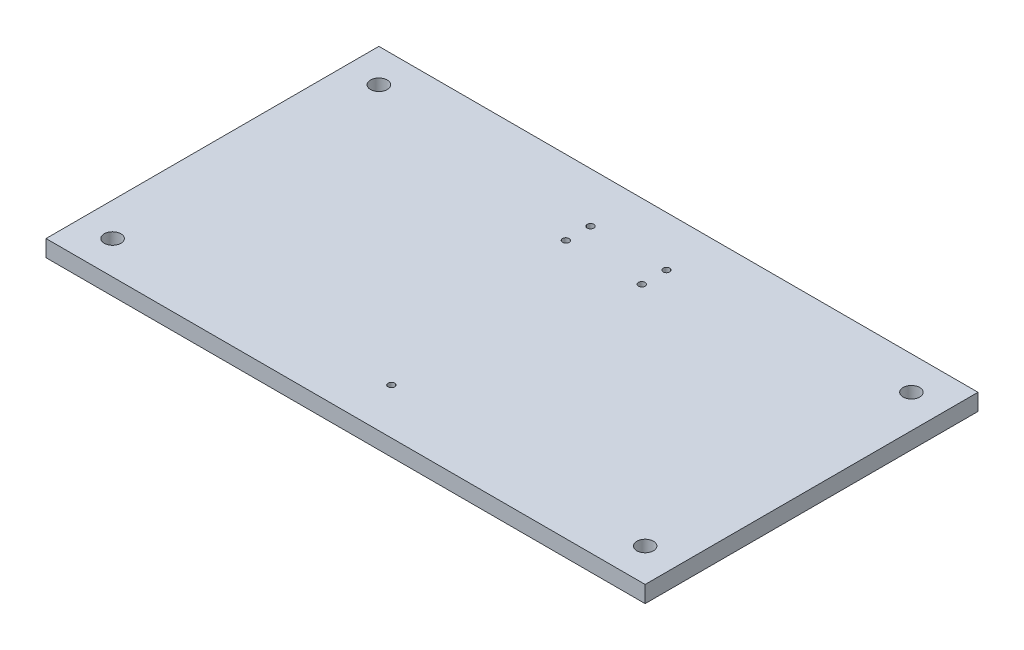
ISO-10303-21;
HEADER;
FILE_DESCRIPTION(('STEP AP214'),'2;1');
FILE_NAME('part.step','',(''),(''),'','','');
FILE_SCHEMA(('AUTOMOTIVE_DESIGN { 1 0 10303 214 1 1 1 1 }'));
ENDSEC;
DATA;
#1=APPLICATION_CONTEXT('core data for automotive mechanical design processes');
#2=APPLICATION_PROTOCOL_DEFINITION('international standard','automotive_design',2000,#1);
#3=PRODUCT_CONTEXT('',#1,'mechanical');
#4=PRODUCT('Part','Part','',(#3));
#5=PRODUCT_RELATED_PRODUCT_CATEGORY('part','',(#4));
#6=PRODUCT_DEFINITION_FORMATION('','',#4);
#7=PRODUCT_DEFINITION_CONTEXT('part definition',#1,'design');
#8=PRODUCT_DEFINITION('design','',#6,#7);
#9=PRODUCT_DEFINITION_SHAPE('','',#8);
#10=(LENGTH_UNIT() NAMED_UNIT(*) SI_UNIT(.MILLI.,.METRE.));
#11=(NAMED_UNIT(*) PLANE_ANGLE_UNIT() SI_UNIT($,.RADIAN.));
#12=(NAMED_UNIT(*) SI_UNIT($,.STERADIAN.) SOLID_ANGLE_UNIT());
#13=UNCERTAINTY_MEASURE_WITH_UNIT(LENGTH_MEASURE(1.E-05),#10,'distance_accuracy_value','');
#14=(GEOMETRIC_REPRESENTATION_CONTEXT(3) GLOBAL_UNCERTAINTY_ASSIGNED_CONTEXT((#13)) GLOBAL_UNIT_ASSIGNED_CONTEXT((#10,
#11,#12)) REPRESENTATION_CONTEXT('',''));
#15=CARTESIAN_POINT('',(0.,0.,0.));
#16=DIRECTION('',(0.,0.,1.));
#17=DIRECTION('',(1.,0.,0.));
#18=AXIS2_PLACEMENT_3D('',#15,#16,#17);
#19=CARTESIAN_POINT('',(0.,6.35,0.));
#20=DIRECTION('',(0.,-1.,0.));
#21=DIRECTION('',(0.,0.,-1.));
#22=AXIS2_PLACEMENT_3D('',#19,#20,#21);
#23=PLANE('',#22);
#24=DIRECTION('',(0.,0.,-1.));
#25=VECTOR('',#24,1.);
#26=CARTESIAN_POINT('',(190.5,6.35,69.85));
#27=LINE('',#26,#25);
#28=CARTESIAN_POINT('',(190.5,6.35,69.85));
#29=VERTEX_POINT('',#28);
#30=CARTESIAN_POINT('',(190.5,6.35,-57.15));
#31=VERTEX_POINT('',#30);
#32=EDGE_CURVE('E84',#29,#31,#27,.T.);
#33=ORIENTED_EDGE('',*,*,#32,.T.);
#34=DIRECTION('',(-1.,0.,0.));
#35=VECTOR('',#34,1.);
#36=CARTESIAN_POINT('',(-38.1,6.35,-57.15));
#37=LINE('',#36,#35);
#38=CARTESIAN_POINT('',(-38.1,6.35,-57.15));
#39=VERTEX_POINT('',#38);
#40=EDGE_CURVE('E79',#31,#39,#37,.T.);
#41=ORIENTED_EDGE('',*,*,#40,.T.);
#42=DIRECTION('',(0.,0.,1.));
#43=VECTOR('',#42,1.);
#44=CARTESIAN_POINT('',(-38.1,6.35,69.85));
#45=LINE('',#44,#43);
#46=CARTESIAN_POINT('',(-38.1,6.35,69.85));
#47=VERTEX_POINT('',#46);
#48=EDGE_CURVE('E82',#39,#47,#45,.T.);
#49=ORIENTED_EDGE('',*,*,#48,.T.);
#50=DIRECTION('',(1.,0.,0.));
#51=VECTOR('',#50,1.);
#52=CARTESIAN_POINT('',(-38.1,6.35,69.85));
#53=LINE('',#52,#51);
#54=EDGE_CURVE('E49',#47,#29,#53,.T.);
#55=ORIENTED_EDGE('',*,*,#54,.T.);
#56=EDGE_LOOP('',(#33,#41,#49,#55));
#57=FACE_BOUND('',#56,.T.);
#58=CARTESIAN_POINT('',(61.71311,6.35,-38.1));
#59=DIRECTION('',(0.,1.,0.));
#60=DIRECTION('',(0.,0.,1.));
#61=AXIS2_PLACEMENT_3D('',#58,#59,#60);
#62=CIRCLE('',#61,1.26999999999999);
#63=CARTESIAN_POINT('',(61.71311,6.35,-36.83));
#64=VERTEX_POINT('',#63);
#65=EDGE_CURVE('E99',#64,#64,#62,.T.);
#66=ORIENTED_EDGE('',*,*,#65,.F.);
#67=EDGE_LOOP('',(#66));
#68=FACE_BOUND('',#67,.T.);
#69=CARTESIAN_POINT('',(90.68689,6.35,-38.1));
#70=DIRECTION('',(0.,1.,0.));
#71=DIRECTION('',(0.,0.,1.));
#72=AXIS2_PLACEMENT_3D('',#69,#70,#71);
#73=CIRCLE('',#72,1.26999999999999);
#74=CARTESIAN_POINT('',(90.68689,6.35,-36.83));
#75=VERTEX_POINT('',#74);
#76=EDGE_CURVE('E114',#75,#75,#73,.T.);
#77=ORIENTED_EDGE('',*,*,#76,.F.);
#78=EDGE_LOOP('',(#77));
#79=FACE_BOUND('',#78,.T.);
#80=CARTESIAN_POINT('',(76.2,6.35,52.35956));
#81=DIRECTION('',(0.,1.,0.));
#82=DIRECTION('',(0.,0.,1.));
#83=AXIS2_PLACEMENT_3D('',#80,#81,#82);
#84=CIRCLE('',#83,1.27000000000001);
#85=CARTESIAN_POINT('',(76.2,6.35,53.62956));
#86=VERTEX_POINT('',#85);
#87=EDGE_CURVE('E120',#86,#86,#84,.T.);
#88=ORIENTED_EDGE('',*,*,#87,.F.);
#89=EDGE_LOOP('',(#88));
#90=FACE_BOUND('',#89,.T.);
#91=CARTESIAN_POINT('',(61.71311,6.35,-28.69946));
#92=DIRECTION('',(0.,1.,0.));
#93=DIRECTION('',(0.,0.,1.));
#94=AXIS2_PLACEMENT_3D('',#91,#92,#93);
#95=CIRCLE('',#94,1.26999999999999);
#96=CARTESIAN_POINT('',(61.71311,6.35,-27.42946));
#97=VERTEX_POINT('',#96);
#98=EDGE_CURVE('E126',#97,#97,#95,.T.);
#99=ORIENTED_EDGE('',*,*,#98,.F.);
#100=EDGE_LOOP('',(#99));
#101=FACE_BOUND('',#100,.T.);
#102=CARTESIAN_POINT('',(90.68689,6.35,-28.69946));
#103=DIRECTION('',(0.,1.,0.));
#104=DIRECTION('',(0.,0.,1.));
#105=AXIS2_PLACEMENT_3D('',#102,#103,#104);
#106=CIRCLE('',#105,1.26999999999999);
#107=CARTESIAN_POINT('',(90.68689,6.35,-27.42946));
#108=VERTEX_POINT('',#107);
#109=EDGE_CURVE('E132',#108,#108,#106,.T.);
#110=ORIENTED_EDGE('',*,*,#109,.F.);
#111=EDGE_LOOP('',(#110));
#112=FACE_BOUND('',#111,.T.);
#113=CARTESIAN_POINT('',(-25.4,6.35,-44.45));
#114=DIRECTION('',(0.,1.,0.));
#115=DIRECTION('',(0.,0.,1.));
#116=AXIS2_PLACEMENT_3D('',#113,#114,#115);
#117=CIRCLE('',#116,3.175);
#118=CARTESIAN_POINT('',(-25.4,6.35,-41.275));
#119=VERTEX_POINT('',#118);
#120=EDGE_CURVE('E138',#119,#119,#117,.T.);
#121=ORIENTED_EDGE('',*,*,#120,.F.);
#122=EDGE_LOOP('',(#121));
#123=FACE_BOUND('',#122,.T.);
#124=CARTESIAN_POINT('',(177.8,6.35,-44.45));
#125=DIRECTION('',(0.,1.,0.));
#126=DIRECTION('',(0.,0.,1.));
#127=AXIS2_PLACEMENT_3D('',#124,#125,#126);
#128=CIRCLE('',#127,3.175);
#129=CARTESIAN_POINT('',(177.8,6.35,-41.275));
#130=VERTEX_POINT('',#129);
#131=EDGE_CURVE('E144',#130,#130,#128,.T.);
#132=ORIENTED_EDGE('',*,*,#131,.F.);
#133=EDGE_LOOP('',(#132));
#134=FACE_BOUND('',#133,.T.);
#135=CARTESIAN_POINT('',(177.800000000001,6.35,57.15));
#136=DIRECTION('',(0.,1.,0.));
#137=DIRECTION('',(0.,0.,1.));
#138=AXIS2_PLACEMENT_3D('',#135,#136,#137);
#139=CIRCLE('',#138,3.175);
#140=CARTESIAN_POINT('',(177.800000000001,6.35,60.325));
#141=VERTEX_POINT('',#140);
#142=EDGE_CURVE('E150',#141,#141,#139,.T.);
#143=ORIENTED_EDGE('',*,*,#142,.F.);
#144=EDGE_LOOP('',(#143));
#145=FACE_BOUND('',#144,.T.);
#146=CARTESIAN_POINT('',(-25.3999999999989,6.35,57.15));
#147=DIRECTION('',(0.,1.,0.));
#148=DIRECTION('',(0.,0.,1.));
#149=AXIS2_PLACEMENT_3D('',#146,#147,#148);
#150=CIRCLE('',#149,3.175);
#151=CARTESIAN_POINT('',(-25.3999999999989,6.35,60.325));
#152=VERTEX_POINT('',#151);
#153=EDGE_CURVE('E156',#152,#152,#150,.T.);
#154=ORIENTED_EDGE('',*,*,#153,.F.);
#155=EDGE_LOOP('',(#154));
#156=FACE_BOUND('',#155,.T.);
#157=ADVANCED_FACE('F32',(#57,#68,#79,#90,#101,#112,#123,#134,#145,#156),#23,.F.);
#158=CARTESIAN_POINT('',(0.,0.,0.));
#159=DIRECTION('',(0.,-1.,0.));
#160=DIRECTION('',(0.,0.,-1.));
#161=AXIS2_PLACEMENT_3D('',#158,#159,#160);
#162=PLANE('',#161);
#163=CARTESIAN_POINT('',(177.800000000001,0.,57.15));
#164=DIRECTION('',(0.,1.,0.));
#165=DIRECTION('',(0.,0.,1.));
#166=AXIS2_PLACEMENT_3D('',#163,#164,#165);
#167=CIRCLE('',#166,3.175);
#168=CARTESIAN_POINT('',(177.800000000001,0.,60.325));
#169=VERTEX_POINT('',#168);
#170=EDGE_CURVE('E153',#169,#169,#167,.T.);
#171=ORIENTED_EDGE('',*,*,#170,.T.);
#172=EDGE_LOOP('',(#171));
#173=FACE_BOUND('',#172,.T.);
#174=CARTESIAN_POINT('',(-25.4,0.,-44.45));
#175=DIRECTION('',(0.,1.,0.));
#176=DIRECTION('',(0.,0.,1.));
#177=AXIS2_PLACEMENT_3D('',#174,#175,#176);
#178=CIRCLE('',#177,3.175);
#179=CARTESIAN_POINT('',(-25.4,0.,-41.275));
#180=VERTEX_POINT('',#179);
#181=EDGE_CURVE('E141',#180,#180,#178,.T.);
#182=ORIENTED_EDGE('',*,*,#181,.T.);
#183=EDGE_LOOP('',(#182));
#184=FACE_BOUND('',#183,.T.);
#185=CARTESIAN_POINT('',(61.71311,0.,-28.69946));
#186=DIRECTION('',(0.,1.,0.));
#187=DIRECTION('',(0.,0.,1.));
#188=AXIS2_PLACEMENT_3D('',#185,#186,#187);
#189=CIRCLE('',#188,1.26999999999999);
#190=CARTESIAN_POINT('',(61.71311,0.,-27.42946));
#191=VERTEX_POINT('',#190);
#192=EDGE_CURVE('E129',#191,#191,#189,.T.);
#193=ORIENTED_EDGE('',*,*,#192,.T.);
#194=EDGE_LOOP('',(#193));
#195=FACE_BOUND('',#194,.T.);
#196=CARTESIAN_POINT('',(90.68689,0.,-38.1));
#197=DIRECTION('',(0.,1.,0.));
#198=DIRECTION('',(0.,0.,1.));
#199=AXIS2_PLACEMENT_3D('',#196,#197,#198);
#200=CIRCLE('',#199,1.26999999999999);
#201=CARTESIAN_POINT('',(90.68689,0.,-36.83));
#202=VERTEX_POINT('',#201);
#203=EDGE_CURVE('E117',#202,#202,#200,.T.);
#204=ORIENTED_EDGE('',*,*,#203,.T.);
#205=EDGE_LOOP('',(#204));
#206=FACE_BOUND('',#205,.T.);
#207=DIRECTION('',(0.,0.,-1.));
#208=VECTOR('',#207,1.);
#209=CARTESIAN_POINT('',(190.5,0.,69.85));
#210=LINE('',#209,#208);
#211=CARTESIAN_POINT('',(190.5,0.,69.85));
#212=VERTEX_POINT('',#211);
#213=CARTESIAN_POINT('',(190.5,0.,-57.15));
#214=VERTEX_POINT('',#213);
#215=EDGE_CURVE('E96',#212,#214,#210,.T.);
#216=ORIENTED_EDGE('',*,*,#215,.F.);
#217=DIRECTION('',(1.,0.,0.));
#218=VECTOR('',#217,1.);
#219=CARTESIAN_POINT('',(-38.1,0.,69.85));
#220=LINE('',#219,#218);
#221=CARTESIAN_POINT('',(-38.1,0.,69.85));
#222=VERTEX_POINT('',#221);
#223=EDGE_CURVE('E72',#222,#212,#220,.T.);
#224=ORIENTED_EDGE('',*,*,#223,.F.);
#225=DIRECTION('',(0.,0.,1.));
#226=VECTOR('',#225,1.);
#227=CARTESIAN_POINT('',(-38.1,0.,69.85));
#228=LINE('',#227,#226);
#229=CARTESIAN_POINT('',(-38.1,0.,-57.15));
#230=VERTEX_POINT('',#229);
#231=EDGE_CURVE('E66',#230,#222,#228,.T.);
#232=ORIENTED_EDGE('',*,*,#231,.F.);
#233=DIRECTION('',(-1.,0.,0.));
#234=VECTOR('',#233,1.);
#235=CARTESIAN_POINT('',(-38.1,0.,-57.15));
#236=LINE('',#235,#234);
#237=EDGE_CURVE('E88',#214,#230,#236,.T.);
#238=ORIENTED_EDGE('',*,*,#237,.F.);
#239=EDGE_LOOP('',(#216,#224,#232,#238));
#240=FACE_BOUND('',#239,.T.);
#241=CARTESIAN_POINT('',(61.71311,0.,-38.1));
#242=DIRECTION('',(0.,1.,0.));
#243=DIRECTION('',(0.,0.,1.));
#244=AXIS2_PLACEMENT_3D('',#241,#242,#243);
#245=CIRCLE('',#244,1.26999999999999);
#246=CARTESIAN_POINT('',(61.71311,0.,-36.83));
#247=VERTEX_POINT('',#246);
#248=EDGE_CURVE('E111',#247,#247,#245,.T.);
#249=ORIENTED_EDGE('',*,*,#248,.T.);
#250=EDGE_LOOP('',(#249));
#251=FACE_BOUND('',#250,.T.);
#252=CARTESIAN_POINT('',(76.2,0.,52.35956));
#253=DIRECTION('',(0.,1.,0.));
#254=DIRECTION('',(0.,0.,1.));
#255=AXIS2_PLACEMENT_3D('',#252,#253,#254);
#256=CIRCLE('',#255,1.27000000000001);
#257=CARTESIAN_POINT('',(76.2,0.,53.62956));
#258=VERTEX_POINT('',#257);
#259=EDGE_CURVE('E123',#258,#258,#256,.T.);
#260=ORIENTED_EDGE('',*,*,#259,.T.);
#261=EDGE_LOOP('',(#260));
#262=FACE_BOUND('',#261,.T.);
#263=CARTESIAN_POINT('',(90.68689,0.,-28.69946));
#264=DIRECTION('',(0.,1.,0.));
#265=DIRECTION('',(0.,0.,1.));
#266=AXIS2_PLACEMENT_3D('',#263,#264,#265);
#267=CIRCLE('',#266,1.26999999999999);
#268=CARTESIAN_POINT('',(90.68689,0.,-27.42946));
#269=VERTEX_POINT('',#268);
#270=EDGE_CURVE('E135',#269,#269,#267,.T.);
#271=ORIENTED_EDGE('',*,*,#270,.T.);
#272=EDGE_LOOP('',(#271));
#273=FACE_BOUND('',#272,.T.);
#274=CARTESIAN_POINT('',(177.8,0.,-44.45));
#275=DIRECTION('',(0.,1.,0.));
#276=DIRECTION('',(0.,0.,1.));
#277=AXIS2_PLACEMENT_3D('',#274,#275,#276);
#278=CIRCLE('',#277,3.175);
#279=CARTESIAN_POINT('',(177.8,0.,-41.275));
#280=VERTEX_POINT('',#279);
#281=EDGE_CURVE('E147',#280,#280,#278,.T.);
#282=ORIENTED_EDGE('',*,*,#281,.T.);
#283=EDGE_LOOP('',(#282));
#284=FACE_BOUND('',#283,.T.);
#285=CARTESIAN_POINT('',(-25.3999999999989,0.,57.15));
#286=DIRECTION('',(0.,1.,0.));
#287=DIRECTION('',(0.,0.,1.));
#288=AXIS2_PLACEMENT_3D('',#285,#286,#287);
#289=CIRCLE('',#288,3.175);
#290=CARTESIAN_POINT('',(-25.3999999999989,0.,60.325));
#291=VERTEX_POINT('',#290);
#292=EDGE_CURVE('E159',#291,#291,#289,.T.);
#293=ORIENTED_EDGE('',*,*,#292,.T.);
#294=EDGE_LOOP('',(#293));
#295=FACE_BOUND('',#294,.T.);
#296=ADVANCED_FACE('F107',(#173,#184,#195,#206,#240,#251,#262,#273,#284,#295),#162,.T.);
#297=CARTESIAN_POINT('',(190.5,6.35,69.85));
#298=DIRECTION('',(-1.,0.,0.));
#299=DIRECTION('',(0.,0.,1.));
#300=AXIS2_PLACEMENT_3D('',#297,#298,#299);
#301=PLANE('',#300);
#302=ORIENTED_EDGE('',*,*,#215,.T.);
#303=DIRECTION('',(0.,-1.,0.));
#304=VECTOR('',#303,1.);
#305=CARTESIAN_POINT('',(190.5,6.35,-57.15));
#306=LINE('',#305,#304);
#307=EDGE_CURVE('E11',#31,#214,#306,.T.);
#308=ORIENTED_EDGE('',*,*,#307,.F.);
#309=ORIENTED_EDGE('',*,*,#32,.F.);
#310=DIRECTION('',(0.,-1.,0.));
#311=VECTOR('',#310,1.);
#312=CARTESIAN_POINT('',(190.5,6.35,69.85));
#313=LINE('',#312,#311);
#314=EDGE_CURVE('E92',#29,#212,#313,.T.);
#315=ORIENTED_EDGE('',*,*,#314,.T.);
#316=EDGE_LOOP('',(#302,#308,#309,#315));
#317=FACE_BOUND('',#316,.T.);
#318=ADVANCED_FACE('F34',(#317),#301,.F.);
#319=CARTESIAN_POINT('',(-38.1,6.35,-57.15));
#320=DIRECTION('',(0.,0.,1.));
#321=DIRECTION('',(1.,0.,0.));
#322=AXIS2_PLACEMENT_3D('',#319,#320,#321);
#323=PLANE('',#322);
#324=ORIENTED_EDGE('',*,*,#237,.T.);
#325=DIRECTION('',(0.,-1.,0.));
#326=VECTOR('',#325,1.);
#327=CARTESIAN_POINT('',(-38.1,6.35,-57.15));
#328=LINE('',#327,#326);
#329=EDGE_CURVE('E41',#39,#230,#328,.T.);
#330=ORIENTED_EDGE('',*,*,#329,.F.);
#331=ORIENTED_EDGE('',*,*,#40,.F.);
#332=ORIENTED_EDGE('',*,*,#307,.T.);
#333=EDGE_LOOP('',(#324,#330,#331,#332));
#334=FACE_BOUND('',#333,.T.);
#335=ADVANCED_FACE('F87',(#334),#323,.F.);
#336=CARTESIAN_POINT('',(-38.1,6.35,69.85));
#337=DIRECTION('',(1.,0.,0.));
#338=DIRECTION('',(0.,0.,-1.));
#339=AXIS2_PLACEMENT_3D('',#336,#337,#338);
#340=PLANE('',#339);
#341=ORIENTED_EDGE('',*,*,#231,.T.);
#342=DIRECTION('',(0.,-1.,0.));
#343=VECTOR('',#342,1.);
#344=CARTESIAN_POINT('',(-38.1,6.35,69.85));
#345=LINE('',#344,#343);
#346=EDGE_CURVE('E89',#47,#222,#345,.T.);
#347=ORIENTED_EDGE('',*,*,#346,.F.);
#348=ORIENTED_EDGE('',*,*,#48,.F.);
#349=ORIENTED_EDGE('',*,*,#329,.T.);
#350=EDGE_LOOP('',(#341,#347,#348,#349));
#351=FACE_BOUND('',#350,.T.);
#352=ADVANCED_FACE('F90',(#351),#340,.F.);
#353=CARTESIAN_POINT('',(-38.1,6.35,69.85));
#354=DIRECTION('',(0.,0.,-1.));
#355=DIRECTION('',(-1.,0.,0.));
#356=AXIS2_PLACEMENT_3D('',#353,#354,#355);
#357=PLANE('',#356);
#358=ORIENTED_EDGE('',*,*,#223,.T.);
#359=ORIENTED_EDGE('',*,*,#314,.F.);
#360=ORIENTED_EDGE('',*,*,#54,.F.);
#361=ORIENTED_EDGE('',*,*,#346,.T.);
#362=EDGE_LOOP('',(#358,#359,#360,#361));
#363=FACE_BOUND('',#362,.T.);
#364=ADVANCED_FACE('F104',(#363),#357,.F.);
#365=CARTESIAN_POINT('',(61.71311,6.35,-38.1));
#366=DIRECTION('',(0.,-1.,0.));
#367=DIRECTION('',(0.,0.,-1.));
#368=AXIS2_PLACEMENT_3D('',#365,#366,#367);
#369=CYLINDRICAL_SURFACE('',#368,1.26999999999999);
#370=ORIENTED_EDGE('',*,*,#65,.T.);
#371=EDGE_LOOP('',(#370));
#372=FACE_BOUND('',#371,.T.);
#373=ORIENTED_EDGE('',*,*,#248,.F.);
#374=EDGE_LOOP('',(#373));
#375=FACE_BOUND('',#374,.T.);
#376=ADVANCED_FACE('F176',(#372,#375),#369,.F.);
#377=CARTESIAN_POINT('',(90.68689,6.35,-38.1));
#378=DIRECTION('',(0.,-1.,0.));
#379=DIRECTION('',(0.,0.,-1.));
#380=AXIS2_PLACEMENT_3D('',#377,#378,#379);
#381=CYLINDRICAL_SURFACE('',#380,1.26999999999999);
#382=ORIENTED_EDGE('',*,*,#76,.T.);
#383=EDGE_LOOP('',(#382));
#384=FACE_BOUND('',#383,.T.);
#385=ORIENTED_EDGE('',*,*,#203,.F.);
#386=EDGE_LOOP('',(#385));
#387=FACE_BOUND('',#386,.T.);
#388=ADVANCED_FACE('F222',(#384,#387),#381,.F.);
#389=CARTESIAN_POINT('',(76.2,6.35,52.35956));
#390=DIRECTION('',(0.,-1.,0.));
#391=DIRECTION('',(0.,0.,-1.));
#392=AXIS2_PLACEMENT_3D('',#389,#390,#391);
#393=CYLINDRICAL_SURFACE('',#392,1.27000000000001);
#394=ORIENTED_EDGE('',*,*,#87,.T.);
#395=EDGE_LOOP('',(#394));
#396=FACE_BOUND('',#395,.T.);
#397=ORIENTED_EDGE('',*,*,#259,.F.);
#398=EDGE_LOOP('',(#397));
#399=FACE_BOUND('',#398,.T.);
#400=ADVANCED_FACE('F230',(#396,#399),#393,.F.);
#401=CARTESIAN_POINT('',(61.71311,6.35,-28.69946));
#402=DIRECTION('',(0.,-1.,0.));
#403=DIRECTION('',(0.,0.,-1.));
#404=AXIS2_PLACEMENT_3D('',#401,#402,#403);
#405=CYLINDRICAL_SURFACE('',#404,1.26999999999999);
#406=ORIENTED_EDGE('',*,*,#98,.T.);
#407=EDGE_LOOP('',(#406));
#408=FACE_BOUND('',#407,.T.);
#409=ORIENTED_EDGE('',*,*,#192,.F.);
#410=EDGE_LOOP('',(#409));
#411=FACE_BOUND('',#410,.T.);
#412=ADVANCED_FACE('F238',(#408,#411),#405,.F.);
#413=CARTESIAN_POINT('',(90.68689,6.35,-28.69946));
#414=DIRECTION('',(0.,-1.,0.));
#415=DIRECTION('',(0.,0.,-1.));
#416=AXIS2_PLACEMENT_3D('',#413,#414,#415);
#417=CYLINDRICAL_SURFACE('',#416,1.26999999999999);
#418=ORIENTED_EDGE('',*,*,#109,.T.);
#419=EDGE_LOOP('',(#418));
#420=FACE_BOUND('',#419,.T.);
#421=ORIENTED_EDGE('',*,*,#270,.F.);
#422=EDGE_LOOP('',(#421));
#423=FACE_BOUND('',#422,.T.);
#424=ADVANCED_FACE('F247',(#420,#423),#417,.F.);
#425=CARTESIAN_POINT('',(-25.4,6.35,-44.45));
#426=DIRECTION('',(0.,-1.,0.));
#427=DIRECTION('',(0.,0.,-1.));
#428=AXIS2_PLACEMENT_3D('',#425,#426,#427);
#429=CYLINDRICAL_SURFACE('',#428,3.175);
#430=ORIENTED_EDGE('',*,*,#120,.T.);
#431=EDGE_LOOP('',(#430));
#432=FACE_BOUND('',#431,.T.);
#433=ORIENTED_EDGE('',*,*,#181,.F.);
#434=EDGE_LOOP('',(#433));
#435=FACE_BOUND('',#434,.T.);
#436=ADVANCED_FACE('F256',(#432,#435),#429,.F.);
#437=CARTESIAN_POINT('',(177.8,6.35,-44.45));
#438=DIRECTION('',(0.,-1.,0.));
#439=DIRECTION('',(0.,0.,-1.));
#440=AXIS2_PLACEMENT_3D('',#437,#438,#439);
#441=CYLINDRICAL_SURFACE('',#440,3.175);
#442=ORIENTED_EDGE('',*,*,#131,.T.);
#443=EDGE_LOOP('',(#442));
#444=FACE_BOUND('',#443,.T.);
#445=ORIENTED_EDGE('',*,*,#281,.F.);
#446=EDGE_LOOP('',(#445));
#447=FACE_BOUND('',#446,.T.);
#448=ADVANCED_FACE('F265',(#444,#447),#441,.F.);
#449=CARTESIAN_POINT('',(177.800000000001,6.35,57.15));
#450=DIRECTION('',(0.,-1.,0.));
#451=DIRECTION('',(0.,0.,-1.));
#452=AXIS2_PLACEMENT_3D('',#449,#450,#451);
#453=CYLINDRICAL_SURFACE('',#452,3.175);
#454=ORIENTED_EDGE('',*,*,#142,.T.);
#455=EDGE_LOOP('',(#454));
#456=FACE_BOUND('',#455,.T.);
#457=ORIENTED_EDGE('',*,*,#170,.F.);
#458=EDGE_LOOP('',(#457));
#459=FACE_BOUND('',#458,.T.);
#460=ADVANCED_FACE('F274',(#456,#459),#453,.F.);
#461=CARTESIAN_POINT('',(-25.3999999999989,6.35,57.15));
#462=DIRECTION('',(0.,-1.,0.));
#463=DIRECTION('',(0.,0.,-1.));
#464=AXIS2_PLACEMENT_3D('',#461,#462,#463);
#465=CYLINDRICAL_SURFACE('',#464,3.175);
#466=ORIENTED_EDGE('',*,*,#153,.T.);
#467=EDGE_LOOP('',(#466));
#468=FACE_BOUND('',#467,.T.);
#469=ORIENTED_EDGE('',*,*,#292,.F.);
#470=EDGE_LOOP('',(#469));
#471=FACE_BOUND('',#470,.T.);
#472=ADVANCED_FACE('F165',(#468,#471),#465,.F.);
#473=CLOSED_SHELL('',(#157,#296,#318,#335,#352,#364,#376,#388,#400,#412,#424,#436,#448,#460,#472));
#474=MANIFOLD_SOLID_BREP('B2',#473);
#475=ADVANCED_BREP_SHAPE_REPRESENTATION('',(#18,#474),#14);
#476=SHAPE_DEFINITION_REPRESENTATION(#9,#475);
ENDSEC;
END-ISO-10303-21;
